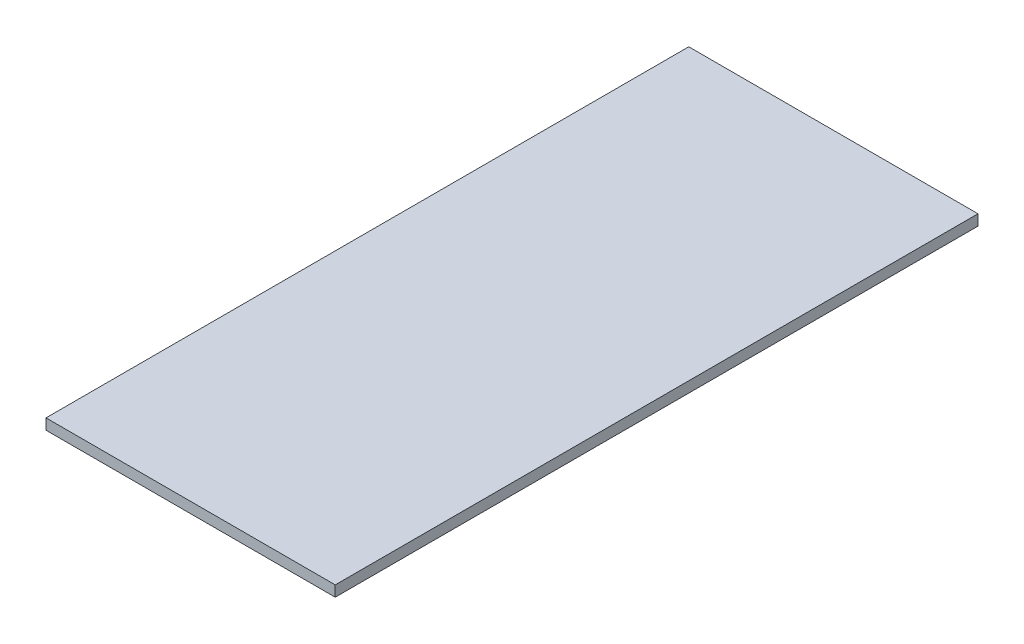
ISO-10303-21;
HEADER;
FILE_DESCRIPTION(('STEP AP214'),'2;1');
FILE_NAME('part.step','',(''),(''),'','','');
FILE_SCHEMA(('AUTOMOTIVE_DESIGN { 1 0 10303 214 1 1 1 1 }'));
ENDSEC;
DATA;
#1=APPLICATION_CONTEXT('core data for automotive mechanical design processes');
#2=APPLICATION_PROTOCOL_DEFINITION('international standard','automotive_design',2000,#1);
#3=PRODUCT_CONTEXT('',#1,'mechanical');
#4=PRODUCT('Part','Part','',(#3));
#5=PRODUCT_RELATED_PRODUCT_CATEGORY('part','',(#4));
#6=PRODUCT_DEFINITION_FORMATION('','',#4);
#7=PRODUCT_DEFINITION_CONTEXT('part definition',#1,'design');
#8=PRODUCT_DEFINITION('design','',#6,#7);
#9=PRODUCT_DEFINITION_SHAPE('','',#8);
#10=(LENGTH_UNIT() NAMED_UNIT(*) SI_UNIT(.MILLI.,.METRE.));
#11=(NAMED_UNIT(*) PLANE_ANGLE_UNIT() SI_UNIT($,.RADIAN.));
#12=(NAMED_UNIT(*) SI_UNIT($,.STERADIAN.) SOLID_ANGLE_UNIT());
#13=UNCERTAINTY_MEASURE_WITH_UNIT(LENGTH_MEASURE(1.E-05),#10,'distance_accuracy_value','');
#14=(GEOMETRIC_REPRESENTATION_CONTEXT(3) GLOBAL_UNCERTAINTY_ASSIGNED_CONTEXT((#13)) GLOBAL_UNIT_ASSIGNED_CONTEXT((#10,
#11,#12)) REPRESENTATION_CONTEXT('',''));
#15=CARTESIAN_POINT('',(0.,0.,0.));
#16=DIRECTION('',(0.,0.,1.));
#17=DIRECTION('',(1.,0.,0.));
#18=AXIS2_PLACEMENT_3D('',#15,#16,#17);
#19=CARTESIAN_POINT('',(0.,0.,0.));
#20=DIRECTION('',(0.,-1.,0.));
#21=DIRECTION('',(0.,0.,-1.));
#22=AXIS2_PLACEMENT_3D('',#19,#20,#21);
#23=PLANE('',#22);
#24=DIRECTION('',(0.,0.,1.));
#25=VECTOR('',#24,1.);
#26=CARTESIAN_POINT('',(-42.8625,0.,-95.25));
#27=LINE('',#26,#25);
#28=CARTESIAN_POINT('',(-42.8625,0.,-95.25));
#29=VERTEX_POINT('',#28);
#30=CARTESIAN_POINT('',(-42.8625,0.,95.25));
#31=VERTEX_POINT('',#30);
#32=EDGE_CURVE('E145',#29,#31,#27,.T.);
#33=ORIENTED_EDGE('',*,*,#32,.F.);
#34=DIRECTION('',(-1.,0.,0.));
#35=VECTOR('',#34,1.);
#36=CARTESIAN_POINT('',(42.8625,0.,-95.25));
#37=LINE('',#36,#35);
#38=CARTESIAN_POINT('',(42.8625,0.,-95.25));
#39=VERTEX_POINT('',#38);
#40=EDGE_CURVE('E141',#39,#29,#37,.T.);
#41=ORIENTED_EDGE('',*,*,#40,.F.);
#42=DIRECTION('',(0.,0.,-1.));
#43=VECTOR('',#42,1.);
#44=CARTESIAN_POINT('',(42.8625,0.,-95.25));
#45=LINE('',#44,#43);
#46=CARTESIAN_POINT('',(42.8625,0.,95.25));
#47=VERTEX_POINT('',#46);
#48=EDGE_CURVE('E225',#47,#39,#45,.T.);
#49=ORIENTED_EDGE('',*,*,#48,.F.);
#50=DIRECTION('',(1.,0.,0.));
#51=VECTOR('',#50,1.);
#52=CARTESIAN_POINT('',(42.8625,0.,95.25));
#53=LINE('',#52,#51);
#54=EDGE_CURVE('E223',#31,#47,#53,.T.);
#55=ORIENTED_EDGE('',*,*,#54,.F.);
#56=EDGE_LOOP('',(#33,#41,#49,#55));
#57=FACE_BOUND('',#56,.T.);
#58=DIRECTION('',(0.,0.,-1.));
#59=VECTOR('',#58,1.);
#60=CARTESIAN_POINT('',(41.5925,0.,0.));
#61=LINE('',#60,#59);
#62=CARTESIAN_POINT('',(41.5925,0.,90.805));
#63=VERTEX_POINT('',#62);
#64=CARTESIAN_POINT('',(41.5925,0.,-90.805));
#65=VERTEX_POINT('',#64);
#66=EDGE_CURVE('E183',#63,#65,#61,.T.);
#67=ORIENTED_EDGE('',*,*,#66,.T.);
#68=CARTESIAN_POINT('',(38.4175,0.,-90.805));
#69=DIRECTION('',(0.,-1.,0.));
#70=DIRECTION('',(0.,0.,-1.));
#71=AXIS2_PLACEMENT_3D('',#68,#69,#70);
#72=CIRCLE('',#71,3.175);
#73=CARTESIAN_POINT('',(38.4175,0.,-93.98));
#74=VERTEX_POINT('',#73);
#75=EDGE_CURVE('E180',#65,#74,#72,.F.);
#76=ORIENTED_EDGE('',*,*,#75,.T.);
#77=DIRECTION('',(-1.,0.,0.));
#78=VECTOR('',#77,1.);
#79=CARTESIAN_POINT('',(0.,0.,-93.98));
#80=LINE('',#79,#78);
#81=CARTESIAN_POINT('',(-38.4175,0.,-93.98));
#82=VERTEX_POINT('',#81);
#83=EDGE_CURVE('E190',#74,#82,#80,.T.);
#84=ORIENTED_EDGE('',*,*,#83,.T.);
#85=CARTESIAN_POINT('',(-38.4175,0.,-90.805));
#86=DIRECTION('',(0.,-1.,0.));
#87=DIRECTION('',(0.,0.,-1.));
#88=AXIS2_PLACEMENT_3D('',#85,#86,#87);
#89=CIRCLE('',#88,3.175);
#90=CARTESIAN_POINT('',(-41.5925,0.,-90.805));
#91=VERTEX_POINT('',#90);
#92=EDGE_CURVE('E178',#82,#91,#89,.F.);
#93=ORIENTED_EDGE('',*,*,#92,.T.);
#94=DIRECTION('',(0.,0.,1.));
#95=VECTOR('',#94,1.);
#96=CARTESIAN_POINT('',(-41.5925,0.,0.));
#97=LINE('',#96,#95);
#98=CARTESIAN_POINT('',(-41.5925,0.,90.805));
#99=VERTEX_POINT('',#98);
#100=EDGE_CURVE('E214',#91,#99,#97,.T.);
#101=ORIENTED_EDGE('',*,*,#100,.T.);
#102=CARTESIAN_POINT('',(-38.4175,0.,90.805));
#103=DIRECTION('',(0.,-1.,0.));
#104=DIRECTION('',(0.,0.,-1.));
#105=AXIS2_PLACEMENT_3D('',#102,#103,#104);
#106=CIRCLE('',#105,3.175);
#107=CARTESIAN_POINT('',(-38.4175,0.,93.98));
#108=VERTEX_POINT('',#107);
#109=EDGE_CURVE('E11',#99,#108,#106,.F.);
#110=ORIENTED_EDGE('',*,*,#109,.T.);
#111=DIRECTION('',(1.,0.,0.));
#112=VECTOR('',#111,1.);
#113=CARTESIAN_POINT('',(0.,0.,93.98));
#114=LINE('',#113,#112);
#115=CARTESIAN_POINT('',(38.4175,0.,93.98));
#116=VERTEX_POINT('',#115);
#117=EDGE_CURVE('E184',#108,#116,#114,.T.);
#118=ORIENTED_EDGE('',*,*,#117,.T.);
#119=CARTESIAN_POINT('',(38.4175,0.,90.805));
#120=DIRECTION('',(0.,-1.,0.));
#121=DIRECTION('',(0.,0.,-1.));
#122=AXIS2_PLACEMENT_3D('',#119,#120,#121);
#123=CIRCLE('',#122,3.175);
#124=EDGE_CURVE('E41',#116,#63,#123,.F.);
#125=ORIENTED_EDGE('',*,*,#124,.T.);
#126=EDGE_LOOP('',(#67,#76,#84,#93,#101,#110,#118,#125));
#127=FACE_BOUND('',#126,.T.);
#128=ADVANCED_FACE('F33',(#57,#127),#23,.T.);
#129=CARTESIAN_POINT('',(-42.8625,3.175,-95.25));
#130=DIRECTION('',(1.,0.,0.));
#131=DIRECTION('',(0.,0.,-1.));
#132=AXIS2_PLACEMENT_3D('',#129,#130,#131);
#133=PLANE('',#132);
#134=ORIENTED_EDGE('',*,*,#32,.T.);
#135=DIRECTION('',(0.,-1.,0.));
#136=VECTOR('',#135,1.);
#137=CARTESIAN_POINT('',(-42.8625,3.175,95.25));
#138=LINE('',#137,#136);
#139=CARTESIAN_POINT('',(-42.8625,3.175,95.25));
#140=VERTEX_POINT('',#139);
#141=EDGE_CURVE('E125',#140,#31,#138,.T.);
#142=ORIENTED_EDGE('',*,*,#141,.F.);
#143=DIRECTION('',(0.,0.,1.));
#144=VECTOR('',#143,1.);
#145=CARTESIAN_POINT('',(-42.8625,3.175,-95.25));
#146=LINE('',#145,#144);
#147=CARTESIAN_POINT('',(-42.8625,3.175,-95.25));
#148=VERTEX_POINT('',#147);
#149=EDGE_CURVE('E132',#148,#140,#146,.T.);
#150=ORIENTED_EDGE('',*,*,#149,.F.);
#151=DIRECTION('',(0.,-1.,0.));
#152=VECTOR('',#151,1.);
#153=CARTESIAN_POINT('',(-42.8625,3.175,-95.25));
#154=LINE('',#153,#152);
#155=EDGE_CURVE('E221',#148,#29,#154,.T.);
#156=ORIENTED_EDGE('',*,*,#155,.T.);
#157=EDGE_LOOP('',(#134,#142,#150,#156));
#158=FACE_BOUND('',#157,.T.);
#159=ADVANCED_FACE('F143',(#158),#133,.F.);
#160=CARTESIAN_POINT('',(42.8625,3.175,95.25));
#161=DIRECTION('',(0.,0.,-1.));
#162=DIRECTION('',(-1.,0.,0.));
#163=AXIS2_PLACEMENT_3D('',#160,#161,#162);
#164=PLANE('',#163);
#165=ORIENTED_EDGE('',*,*,#54,.T.);
#166=DIRECTION('',(0.,-1.,0.));
#167=VECTOR('',#166,1.);
#168=CARTESIAN_POINT('',(42.8625,3.175,95.25));
#169=LINE('',#168,#167);
#170=CARTESIAN_POINT('',(42.8625,3.175,95.25));
#171=VERTEX_POINT('',#170);
#172=EDGE_CURVE('E128',#171,#47,#169,.T.);
#173=ORIENTED_EDGE('',*,*,#172,.F.);
#174=DIRECTION('',(1.,0.,0.));
#175=VECTOR('',#174,1.);
#176=CARTESIAN_POINT('',(42.8625,3.175,95.25));
#177=LINE('',#176,#175);
#178=EDGE_CURVE('E121',#140,#171,#177,.T.);
#179=ORIENTED_EDGE('',*,*,#178,.F.);
#180=ORIENTED_EDGE('',*,*,#141,.T.);
#181=EDGE_LOOP('',(#165,#173,#179,#180));
#182=FACE_BOUND('',#181,.T.);
#183=ADVANCED_FACE('F123',(#182),#164,.F.);
#184=CARTESIAN_POINT('',(42.8625,3.175,-95.25));
#185=DIRECTION('',(-1.,0.,0.));
#186=DIRECTION('',(0.,0.,1.));
#187=AXIS2_PLACEMENT_3D('',#184,#185,#186);
#188=PLANE('',#187);
#189=ORIENTED_EDGE('',*,*,#48,.T.);
#190=DIRECTION('',(0.,-1.,0.));
#191=VECTOR('',#190,1.);
#192=CARTESIAN_POINT('',(42.8625,3.175,-95.25));
#193=LINE('',#192,#191);
#194=CARTESIAN_POINT('',(42.8625,3.175,-95.25));
#195=VERTEX_POINT('',#194);
#196=EDGE_CURVE('E150',#195,#39,#193,.T.);
#197=ORIENTED_EDGE('',*,*,#196,.F.);
#198=DIRECTION('',(0.,0.,-1.));
#199=VECTOR('',#198,1.);
#200=CARTESIAN_POINT('',(42.8625,3.175,-95.25));
#201=LINE('',#200,#199);
#202=EDGE_CURVE('E131',#171,#195,#201,.T.);
#203=ORIENTED_EDGE('',*,*,#202,.F.);
#204=ORIENTED_EDGE('',*,*,#172,.T.);
#205=EDGE_LOOP('',(#189,#197,#203,#204));
#206=FACE_BOUND('',#205,.T.);
#207=ADVANCED_FACE('F236',(#206),#188,.F.);
#208=CARTESIAN_POINT('',(42.8625,3.175,-95.25));
#209=DIRECTION('',(0.,0.,1.));
#210=DIRECTION('',(1.,0.,0.));
#211=AXIS2_PLACEMENT_3D('',#208,#209,#210);
#212=PLANE('',#211);
#213=ORIENTED_EDGE('',*,*,#40,.T.);
#214=ORIENTED_EDGE('',*,*,#155,.F.);
#215=DIRECTION('',(-1.,0.,0.));
#216=VECTOR('',#215,1.);
#217=CARTESIAN_POINT('',(42.8625,3.175,-95.25));
#218=LINE('',#217,#216);
#219=EDGE_CURVE('E137',#195,#148,#218,.T.);
#220=ORIENTED_EDGE('',*,*,#219,.F.);
#221=ORIENTED_EDGE('',*,*,#196,.T.);
#222=EDGE_LOOP('',(#213,#214,#220,#221));
#223=FACE_BOUND('',#222,.T.);
#224=ADVANCED_FACE('F232',(#223),#212,.F.);
#225=CARTESIAN_POINT('',(0.,3.175,0.));
#226=DIRECTION('',(0.,-1.,0.));
#227=DIRECTION('',(0.,0.,-1.));
#228=AXIS2_PLACEMENT_3D('',#225,#226,#227);
#229=PLANE('',#228);
#230=ORIENTED_EDGE('',*,*,#149,.T.);
#231=ORIENTED_EDGE('',*,*,#178,.T.);
#232=ORIENTED_EDGE('',*,*,#202,.T.);
#233=ORIENTED_EDGE('',*,*,#219,.T.);
#234=EDGE_LOOP('',(#230,#231,#232,#233));
#235=FACE_BOUND('',#234,.T.);
#236=ADVANCED_FACE('F135',(#235),#229,.F.);
#237=CARTESIAN_POINT('',(-41.5925,3.175,-95.25));
#238=DIRECTION('',(1.,0.,0.));
#239=DIRECTION('',(0.,0.,-1.));
#240=AXIS2_PLACEMENT_3D('',#237,#238,#239);
#241=PLANE('',#240);
#242=ORIENTED_EDGE('',*,*,#100,.F.);
#243=DIRECTION('',(0.,-1.,0.));
#244=VECTOR('',#243,1.);
#245=CARTESIAN_POINT('',(-41.5925,1.905,-90.805));
#246=LINE('',#245,#244);
#247=CARTESIAN_POINT('',(-41.5925,1.905,-90.805));
#248=VERTEX_POINT('',#247);
#249=EDGE_CURVE('E159',#91,#248,#246,.F.);
#250=ORIENTED_EDGE('',*,*,#249,.T.);
#251=DIRECTION('',(0.,0.,1.));
#252=VECTOR('',#251,1.);
#253=CARTESIAN_POINT('',(-41.5925,1.905,0.));
#254=LINE('',#253,#252);
#255=CARTESIAN_POINT('',(-41.5925,1.905,90.805));
#256=VERTEX_POINT('',#255);
#257=EDGE_CURVE('E205',#248,#256,#254,.T.);
#258=ORIENTED_EDGE('',*,*,#257,.T.);
#259=DIRECTION('',(0.,-1.,0.));
#260=VECTOR('',#259,1.);
#261=CARTESIAN_POINT('',(-41.5925,0.,90.805));
#262=LINE('',#261,#260);
#263=EDGE_CURVE('E156',#256,#99,#262,.T.);
#264=ORIENTED_EDGE('',*,*,#263,.T.);
#265=EDGE_LOOP('',(#242,#250,#258,#264));
#266=FACE_BOUND('',#265,.T.);
#267=ADVANCED_FACE('F254',(#266),#241,.T.);
#268=CARTESIAN_POINT('',(42.8625,3.175,93.98));
#269=DIRECTION('',(0.,0.,-1.));
#270=DIRECTION('',(-1.,0.,0.));
#271=AXIS2_PLACEMENT_3D('',#268,#269,#270);
#272=PLANE('',#271);
#273=DIRECTION('',(1.,0.,0.));
#274=VECTOR('',#273,1.);
#275=CARTESIAN_POINT('',(0.,1.905,93.98));
#276=LINE('',#275,#274);
#277=CARTESIAN_POINT('',(-38.4175,1.905,93.98));
#278=VERTEX_POINT('',#277);
#279=CARTESIAN_POINT('',(38.4175,1.905,93.98));
#280=VERTEX_POINT('',#279);
#281=EDGE_CURVE('E199',#278,#280,#276,.T.);
#282=ORIENTED_EDGE('',*,*,#281,.T.);
#283=DIRECTION('',(0.,-1.,0.));
#284=VECTOR('',#283,1.);
#285=CARTESIAN_POINT('',(38.4175,0.,93.98));
#286=LINE('',#285,#284);
#287=EDGE_CURVE('E176',#280,#116,#286,.T.);
#288=ORIENTED_EDGE('',*,*,#287,.T.);
#289=ORIENTED_EDGE('',*,*,#117,.F.);
#290=DIRECTION('',(0.,-1.,0.));
#291=VECTOR('',#290,1.);
#292=CARTESIAN_POINT('',(-38.4175,1.905,93.98));
#293=LINE('',#292,#291);
#294=EDGE_CURVE('E174',#108,#278,#293,.F.);
#295=ORIENTED_EDGE('',*,*,#294,.T.);
#296=EDGE_LOOP('',(#282,#288,#289,#295));
#297=FACE_BOUND('',#296,.T.);
#298=ADVANCED_FACE('F203',(#297),#272,.T.);
#299=CARTESIAN_POINT('',(41.5925,3.175,-95.25));
#300=DIRECTION('',(-1.,0.,0.));
#301=DIRECTION('',(0.,0.,1.));
#302=AXIS2_PLACEMENT_3D('',#299,#300,#301);
#303=PLANE('',#302);
#304=DIRECTION('',(0.,0.,-1.));
#305=VECTOR('',#304,1.);
#306=CARTESIAN_POINT('',(41.5925,1.905,0.));
#307=LINE('',#306,#305);
#308=CARTESIAN_POINT('',(41.5925,1.905,90.805));
#309=VERTEX_POINT('',#308);
#310=CARTESIAN_POINT('',(41.5925,1.905,-90.805));
#311=VERTEX_POINT('',#310);
#312=EDGE_CURVE('E201',#309,#311,#307,.T.);
#313=ORIENTED_EDGE('',*,*,#312,.T.);
#314=DIRECTION('',(0.,-1.,0.));
#315=VECTOR('',#314,1.);
#316=CARTESIAN_POINT('',(41.5925,0.,-90.805));
#317=LINE('',#316,#315);
#318=EDGE_CURVE('E171',#311,#65,#317,.T.);
#319=ORIENTED_EDGE('',*,*,#318,.T.);
#320=ORIENTED_EDGE('',*,*,#66,.F.);
#321=DIRECTION('',(0.,-1.,0.));
#322=VECTOR('',#321,1.);
#323=CARTESIAN_POINT('',(41.5925,1.905,90.805));
#324=LINE('',#323,#322);
#325=EDGE_CURVE('E169',#63,#309,#324,.F.);
#326=ORIENTED_EDGE('',*,*,#325,.T.);
#327=EDGE_LOOP('',(#313,#319,#320,#326));
#328=FACE_BOUND('',#327,.T.);
#329=ADVANCED_FACE('F187',(#328),#303,.T.);
#330=CARTESIAN_POINT('',(42.8625,3.175,-93.98));
#331=DIRECTION('',(0.,0.,1.));
#332=DIRECTION('',(1.,0.,0.));
#333=AXIS2_PLACEMENT_3D('',#330,#331,#332);
#334=PLANE('',#333);
#335=DIRECTION('',(-1.,0.,0.));
#336=VECTOR('',#335,1.);
#337=CARTESIAN_POINT('',(0.,1.905,-93.98));
#338=LINE('',#337,#336);
#339=CARTESIAN_POINT('',(38.4175,1.905,-93.98));
#340=VERTEX_POINT('',#339);
#341=CARTESIAN_POINT('',(-38.4175,1.905,-93.98));
#342=VERTEX_POINT('',#341);
#343=EDGE_CURVE('E207',#340,#342,#338,.T.);
#344=ORIENTED_EDGE('',*,*,#343,.T.);
#345=DIRECTION('',(0.,-1.,0.));
#346=VECTOR('',#345,1.);
#347=CARTESIAN_POINT('',(-38.4175,0.,-93.98));
#348=LINE('',#347,#346);
#349=EDGE_CURVE('E148',#342,#82,#348,.T.);
#350=ORIENTED_EDGE('',*,*,#349,.T.);
#351=ORIENTED_EDGE('',*,*,#83,.F.);
#352=DIRECTION('',(0.,-1.,0.));
#353=VECTOR('',#352,1.);
#354=CARTESIAN_POINT('',(38.4175,1.905,-93.98));
#355=LINE('',#354,#353);
#356=EDGE_CURVE('E146',#74,#340,#355,.F.);
#357=ORIENTED_EDGE('',*,*,#356,.T.);
#358=EDGE_LOOP('',(#344,#350,#351,#357));
#359=FACE_BOUND('',#358,.T.);
#360=ADVANCED_FACE('F258',(#359),#334,.T.);
#361=CARTESIAN_POINT('',(0.,1.905,0.));
#362=DIRECTION('',(0.,-1.,0.));
#363=DIRECTION('',(0.,0.,-1.));
#364=AXIS2_PLACEMENT_3D('',#361,#362,#363);
#365=PLANE('',#364);
#366=ORIENTED_EDGE('',*,*,#257,.F.);
#367=CARTESIAN_POINT('',(-38.4175,1.905,-90.805));
#368=DIRECTION('',(0.,-1.,0.));
#369=DIRECTION('',(0.,0.,-1.));
#370=AXIS2_PLACEMENT_3D('',#367,#368,#369);
#371=CIRCLE('',#370,3.175);
#372=EDGE_CURVE('E167',#248,#342,#371,.T.);
#373=ORIENTED_EDGE('',*,*,#372,.T.);
#374=ORIENTED_EDGE('',*,*,#343,.F.);
#375=CARTESIAN_POINT('',(38.4175,1.905,-90.805));
#376=DIRECTION('',(0.,-1.,0.));
#377=DIRECTION('',(0.,0.,-1.));
#378=AXIS2_PLACEMENT_3D('',#375,#376,#377);
#379=CIRCLE('',#378,3.175);
#380=EDGE_CURVE('E165',#340,#311,#379,.T.);
#381=ORIENTED_EDGE('',*,*,#380,.T.);
#382=ORIENTED_EDGE('',*,*,#312,.F.);
#383=CARTESIAN_POINT('',(38.4175,1.905,90.805));
#384=DIRECTION('',(0.,-1.,0.));
#385=DIRECTION('',(0.,0.,-1.));
#386=AXIS2_PLACEMENT_3D('',#383,#384,#385);
#387=CIRCLE('',#386,3.175);
#388=EDGE_CURVE('E163',#309,#280,#387,.T.);
#389=ORIENTED_EDGE('',*,*,#388,.T.);
#390=ORIENTED_EDGE('',*,*,#281,.F.);
#391=CARTESIAN_POINT('',(-38.4175,1.905,90.805));
#392=DIRECTION('',(0.,-1.,0.));
#393=DIRECTION('',(0.,0.,-1.));
#394=AXIS2_PLACEMENT_3D('',#391,#392,#393);
#395=CIRCLE('',#394,3.175);
#396=EDGE_CURVE('E161',#278,#256,#395,.T.);
#397=ORIENTED_EDGE('',*,*,#396,.T.);
#398=EDGE_LOOP('',(#366,#373,#374,#381,#382,#389,#390,#397));
#399=FACE_BOUND('',#398,.T.);
#400=ADVANCED_FACE('F198',(#399),#365,.T.);
#401=CARTESIAN_POINT('',(-38.4175,3.175,-90.805));
#402=DIRECTION('',(0.,1.,0.));
#403=DIRECTION('',(0.,0.,1.));
#404=AXIS2_PLACEMENT_3D('',#401,#402,#403);
#405=CYLINDRICAL_SURFACE('',#404,3.175);
#406=ORIENTED_EDGE('',*,*,#372,.F.);
#407=ORIENTED_EDGE('',*,*,#249,.F.);
#408=ORIENTED_EDGE('',*,*,#92,.F.);
#409=ORIENTED_EDGE('',*,*,#349,.F.);
#410=EDGE_LOOP('',(#406,#407,#408,#409));
#411=FACE_BOUND('',#410,.T.);
#412=ADVANCED_FACE('F257',(#411),#405,.F.);
#413=CARTESIAN_POINT('',(38.4175,3.175,-90.805));
#414=DIRECTION('',(0.,1.,0.));
#415=DIRECTION('',(0.,0.,1.));
#416=AXIS2_PLACEMENT_3D('',#413,#414,#415);
#417=CYLINDRICAL_SURFACE('',#416,3.175);
#418=ORIENTED_EDGE('',*,*,#380,.F.);
#419=ORIENTED_EDGE('',*,*,#356,.F.);
#420=ORIENTED_EDGE('',*,*,#75,.F.);
#421=ORIENTED_EDGE('',*,*,#318,.F.);
#422=EDGE_LOOP('',(#418,#419,#420,#421));
#423=FACE_BOUND('',#422,.T.);
#424=ADVANCED_FACE('F281',(#423),#417,.F.);
#425=CARTESIAN_POINT('',(38.4175,3.175,90.805));
#426=DIRECTION('',(0.,1.,0.));
#427=DIRECTION('',(0.,0.,1.));
#428=AXIS2_PLACEMENT_3D('',#425,#426,#427);
#429=CYLINDRICAL_SURFACE('',#428,3.175);
#430=ORIENTED_EDGE('',*,*,#388,.F.);
#431=ORIENTED_EDGE('',*,*,#325,.F.);
#432=ORIENTED_EDGE('',*,*,#124,.F.);
#433=ORIENTED_EDGE('',*,*,#287,.F.);
#434=EDGE_LOOP('',(#430,#431,#432,#433));
#435=FACE_BOUND('',#434,.T.);
#436=ADVANCED_FACE('F193',(#435),#429,.F.);
#437=CARTESIAN_POINT('',(-38.4175,3.175,90.805));
#438=DIRECTION('',(0.,1.,0.));
#439=DIRECTION('',(0.,0.,1.));
#440=AXIS2_PLACEMENT_3D('',#437,#438,#439);
#441=CYLINDRICAL_SURFACE('',#440,3.175);
#442=ORIENTED_EDGE('',*,*,#396,.F.);
#443=ORIENTED_EDGE('',*,*,#294,.F.);
#444=ORIENTED_EDGE('',*,*,#109,.F.);
#445=ORIENTED_EDGE('',*,*,#263,.F.);
#446=EDGE_LOOP('',(#442,#443,#444,#445));
#447=FACE_BOUND('',#446,.T.);
#448=ADVANCED_FACE('F35',(#447),#441,.F.);
#449=CLOSED_SHELL('',(#128,#159,#183,#207,#224,#236,#267,#298,#329,#360,#400,#412,#424,#436,#448));
#450=MANIFOLD_SOLID_BREP('B2',#449);
#451=ADVANCED_BREP_SHAPE_REPRESENTATION('',(#18,#450),#14);
#452=SHAPE_DEFINITION_REPRESENTATION(#9,#451);
ENDSEC;
END-ISO-10303-21;
